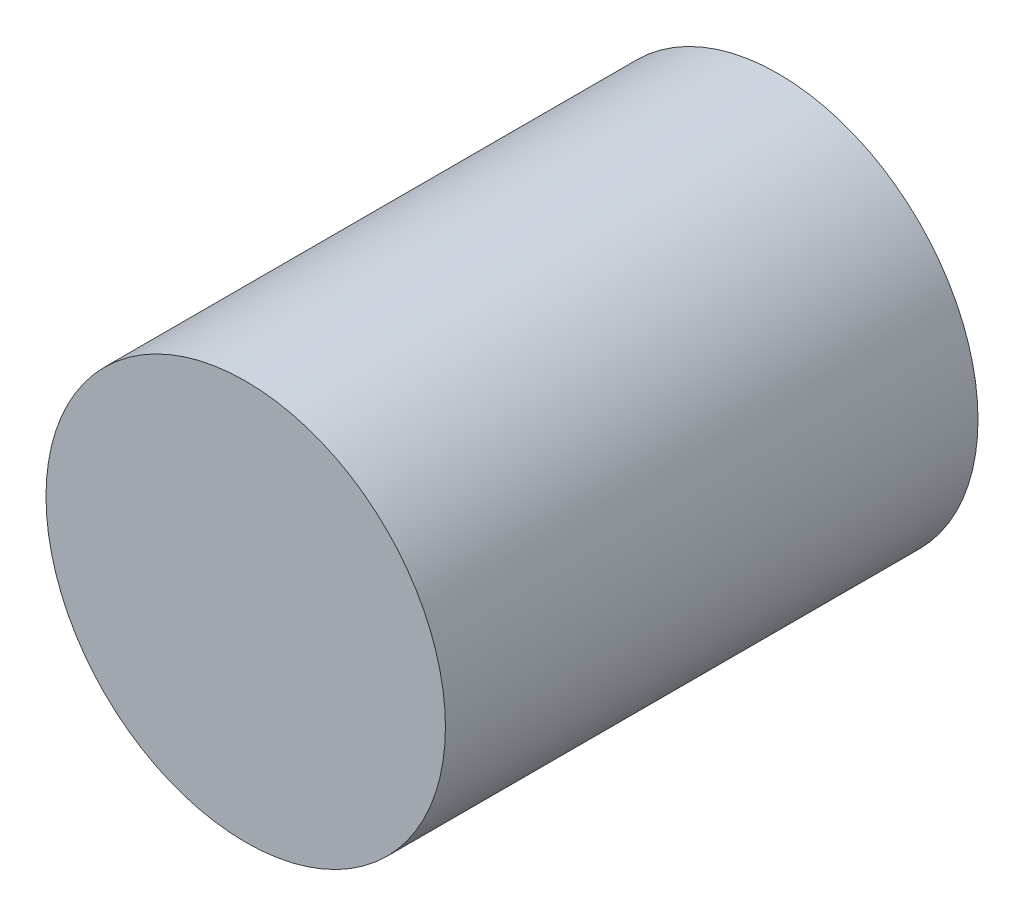
ISO-10303-21;
HEADER;
FILE_DESCRIPTION(('STEP AP214'),'2;1');
FILE_NAME('part.step','',(''),(''),'','','');
FILE_SCHEMA(('AUTOMOTIVE_DESIGN { 1 0 10303 214 1 1 1 1 }'));
ENDSEC;
DATA;
#1=APPLICATION_CONTEXT('core data for automotive mechanical design processes');
#2=APPLICATION_PROTOCOL_DEFINITION('international standard','automotive_design',2000,#1);
#3=PRODUCT_CONTEXT('',#1,'mechanical');
#4=PRODUCT('Part','Part','',(#3));
#5=PRODUCT_RELATED_PRODUCT_CATEGORY('part','',(#4));
#6=PRODUCT_DEFINITION_FORMATION('','',#4);
#7=PRODUCT_DEFINITION_CONTEXT('part definition',#1,'design');
#8=PRODUCT_DEFINITION('design','',#6,#7);
#9=PRODUCT_DEFINITION_SHAPE('','',#8);
#10=(LENGTH_UNIT() NAMED_UNIT(*) SI_UNIT(.MILLI.,.METRE.));
#11=(NAMED_UNIT(*) PLANE_ANGLE_UNIT() SI_UNIT($,.RADIAN.));
#12=(NAMED_UNIT(*) SI_UNIT($,.STERADIAN.) SOLID_ANGLE_UNIT());
#13=UNCERTAINTY_MEASURE_WITH_UNIT(LENGTH_MEASURE(1.E-05),#10,'distance_accuracy_value','');
#14=(GEOMETRIC_REPRESENTATION_CONTEXT(3) GLOBAL_UNCERTAINTY_ASSIGNED_CONTEXT((#13)) GLOBAL_UNIT_ASSIGNED_CONTEXT((#10,
#11,#12)) REPRESENTATION_CONTEXT('',''));
#15=CARTESIAN_POINT('',(0.,0.,0.));
#16=DIRECTION('',(0.,0.,1.));
#17=DIRECTION('',(1.,0.,0.));
#18=AXIS2_PLACEMENT_3D('',#15,#16,#17);
#19=CARTESIAN_POINT('',(0.,0.,80.));
#20=DIRECTION('',(0.,0.,-1.));
#21=DIRECTION('',(-1.,0.,0.));
#22=AXIS2_PLACEMENT_3D('',#19,#20,#21);
#23=CYLINDRICAL_SURFACE('',#22,30.);
#24=CARTESIAN_POINT('',(0.,0.,80.));
#25=DIRECTION('',(0.,0.,1.));
#26=DIRECTION('',(1.,0.,0.));
#27=AXIS2_PLACEMENT_3D('',#24,#25,#26);
#28=CIRCLE('',#27,30.);
#29=CARTESIAN_POINT('',(30.,0.,80.));
#30=VERTEX_POINT('',#29);
#31=EDGE_CURVE('E10',#30,#30,#28,.T.);
#32=ORIENTED_EDGE('',*,*,#31,.F.);
#33=EDGE_LOOP('',(#32));
#34=FACE_BOUND('',#33,.T.);
#35=CARTESIAN_POINT('',(0.,0.,0.));
#36=DIRECTION('',(0.,0.,1.));
#37=DIRECTION('',(1.,0.,0.));
#38=AXIS2_PLACEMENT_3D('',#35,#36,#37);
#39=CIRCLE('',#38,30.);
#40=CARTESIAN_POINT('',(30.,0.,0.));
#41=VERTEX_POINT('',#40);
#42=EDGE_CURVE('E40',#41,#41,#39,.T.);
#43=ORIENTED_EDGE('',*,*,#42,.T.);
#44=EDGE_LOOP('',(#43));
#45=FACE_BOUND('',#44,.T.);
#46=ADVANCED_FACE('F37',(#34,#45),#23,.T.);
#47=CARTESIAN_POINT('',(0.,0.,80.));
#48=DIRECTION('',(0.,0.,1.));
#49=DIRECTION('',(1.,0.,0.));
#50=AXIS2_PLACEMENT_3D('',#47,#48,#49);
#51=PLANE('',#50);
#52=ORIENTED_EDGE('',*,*,#31,.T.);
#53=EDGE_LOOP('',(#52));
#54=FACE_BOUND('',#53,.T.);
#55=ADVANCED_FACE('F52',(#54),#51,.T.);
#56=CARTESIAN_POINT('',(0.,0.,0.));
#57=DIRECTION('',(0.,0.,1.));
#58=DIRECTION('',(1.,0.,0.));
#59=AXIS2_PLACEMENT_3D('',#56,#57,#58);
#60=PLANE('',#59);
#61=ORIENTED_EDGE('',*,*,#42,.F.);
#62=EDGE_LOOP('',(#61));
#63=FACE_BOUND('',#62,.T.);
#64=ADVANCED_FACE('F50',(#63),#60,.F.);
#65=CLOSED_SHELL('',(#46,#55,#64));
#66=MANIFOLD_SOLID_BREP('B2',#65);
#67=ADVANCED_BREP_SHAPE_REPRESENTATION('',(#18,#66),#14);
#68=SHAPE_DEFINITION_REPRESENTATION(#9,#67);
ENDSEC;
END-ISO-10303-21;
